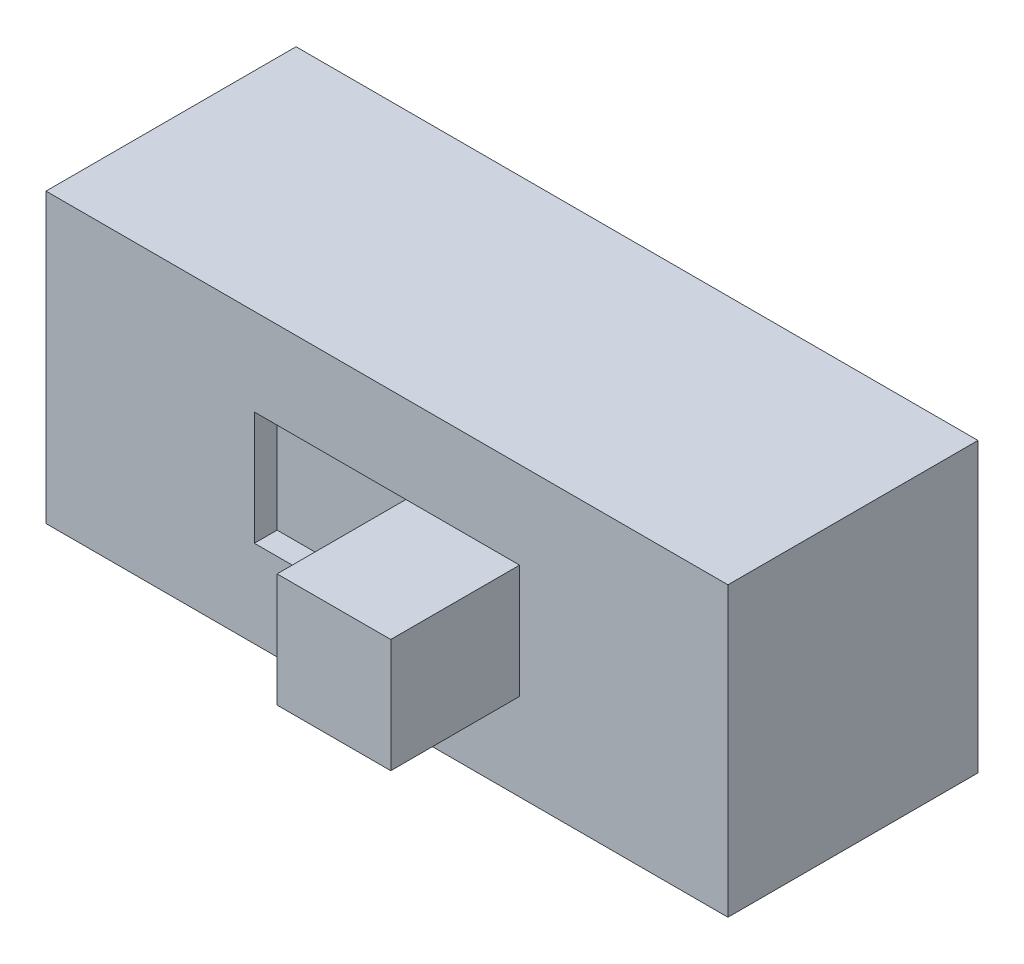
ISO-10303-21;
HEADER;
FILE_DESCRIPTION(('STEP AP214'),'2;1');
FILE_NAME('part.step','',(''),(''),'','','');
FILE_SCHEMA(('AUTOMOTIVE_DESIGN { 1 0 10303 214 1 1 1 1 }'));
ENDSEC;
DATA;
#1=APPLICATION_CONTEXT('core data for automotive mechanical design processes');
#2=APPLICATION_PROTOCOL_DEFINITION('international standard','automotive_design',2000,#1);
#3=PRODUCT_CONTEXT('',#1,'mechanical');
#4=PRODUCT('Part','Part','',(#3));
#5=PRODUCT_RELATED_PRODUCT_CATEGORY('part','',(#4));
#6=PRODUCT_DEFINITION_FORMATION('','',#4);
#7=PRODUCT_DEFINITION_CONTEXT('part definition',#1,'design');
#8=PRODUCT_DEFINITION('design','',#6,#7);
#9=PRODUCT_DEFINITION_SHAPE('','',#8);
#10=(LENGTH_UNIT() NAMED_UNIT(*) SI_UNIT(.MILLI.,.METRE.));
#11=(NAMED_UNIT(*) PLANE_ANGLE_UNIT() SI_UNIT($,.RADIAN.));
#12=(NAMED_UNIT(*) SI_UNIT($,.STERADIAN.) SOLID_ANGLE_UNIT());
#13=UNCERTAINTY_MEASURE_WITH_UNIT(LENGTH_MEASURE(1.E-05),#10,'distance_accuracy_value','');
#14=(GEOMETRIC_REPRESENTATION_CONTEXT(3) GLOBAL_UNCERTAINTY_ASSIGNED_CONTEXT((#13)) GLOBAL_UNIT_ASSIGNED_CONTEXT((#10,
#11,#12)) REPRESENTATION_CONTEXT('',''));
#15=CARTESIAN_POINT('',(0.,0.,0.));
#16=DIRECTION('',(0.,0.,1.));
#17=DIRECTION('',(1.,0.,0.));
#18=AXIS2_PLACEMENT_3D('',#15,#16,#17);
#19=CARTESIAN_POINT('',(1.,0.,5.));
#20=DIRECTION('',(0.,0.,1.));
#21=DIRECTION('',(1.,0.,0.));
#22=AXIS2_PLACEMENT_3D('',#19,#20,#21);
#23=PLANE('',#22);
#24=DIRECTION('',(0.,-1.,0.));
#25=VECTOR('',#24,1.);
#26=CARTESIAN_POINT('',(0.250000000000001,0.75,5.));
#27=LINE('',#26,#25);
#28=CARTESIAN_POINT('',(0.250000000000001,-0.75,5.));
#29=VERTEX_POINT('',#28);
#30=CARTESIAN_POINT('',(0.250000000000001,0.750000000000001,5.));
#31=VERTEX_POINT('',#30);
#32=EDGE_CURVE('E123',#29,#31,#27,.F.);
#33=ORIENTED_EDGE('',*,*,#32,.F.);
#34=DIRECTION('',(1.,0.,0.));
#35=VECTOR('',#34,1.);
#36=CARTESIAN_POINT('',(0.250000000000001,-0.75,5.));
#37=LINE('',#36,#35);
#38=CARTESIAN_POINT('',(1.75,-0.75,5.));
#39=VERTEX_POINT('',#38);
#40=EDGE_CURVE('E141',#39,#29,#37,.F.);
#41=ORIENTED_EDGE('',*,*,#40,.F.);
#42=DIRECTION('',(0.,1.,0.));
#43=VECTOR('',#42,1.);
#44=CARTESIAN_POINT('',(1.75,-0.75,5.));
#45=LINE('',#44,#43);
#46=CARTESIAN_POINT('',(1.75,0.750000000000001,5.));
#47=VERTEX_POINT('',#46);
#48=EDGE_CURVE('E171',#47,#39,#45,.F.);
#49=ORIENTED_EDGE('',*,*,#48,.F.);
#50=DIRECTION('',(-1.,0.,0.));
#51=VECTOR('',#50,1.);
#52=CARTESIAN_POINT('',(1.75,0.750000000000001,5.));
#53=LINE('',#52,#51);
#54=EDGE_CURVE('E176',#31,#47,#53,.F.);
#55=ORIENTED_EDGE('',*,*,#54,.F.);
#56=EDGE_LOOP('',(#33,#41,#49,#55));
#57=FACE_BOUND('',#56,.T.);
#58=ADVANCED_FACE('F16',(#57),#23,.T.);
#59=CARTESIAN_POINT('',(0.250000000000001,0.75,3.));
#60=DIRECTION('',(-1.,0.,0.));
#61=DIRECTION('',(0.,-1.,0.));
#62=AXIS2_PLACEMENT_3D('',#59,#60,#61);
#63=PLANE('',#62);
#64=DIRECTION('',(0.,0.,1.));
#65=VECTOR('',#64,1.);
#66=CARTESIAN_POINT('',(0.250000000000001,0.750000000000001,3.));
#67=LINE('',#66,#65);
#68=CARTESIAN_POINT('',(0.250000000000001,0.75,3.3));
#69=VERTEX_POINT('',#68);
#70=EDGE_CURVE('E178',#69,#31,#67,.T.);
#71=ORIENTED_EDGE('',*,*,#70,.F.);
#72=DIRECTION('',(0.,0.,1.));
#73=VECTOR('',#72,1.);
#74=CARTESIAN_POINT('',(0.250000000000001,0.750000000000001,3.3));
#75=LINE('',#74,#73);
#76=CARTESIAN_POINT('',(0.250000000000001,0.750000000000001,3.));
#77=VERTEX_POINT('',#76);
#78=EDGE_CURVE('E117',#69,#77,#75,.F.);
#79=ORIENTED_EDGE('',*,*,#78,.T.);
#80=DIRECTION('',(0.,1.,0.));
#81=VECTOR('',#80,1.);
#82=CARTESIAN_POINT('',(0.250000000000001,0.,3.));
#83=LINE('',#82,#81);
#84=CARTESIAN_POINT('',(0.250000000000001,-0.75,3.));
#85=VERTEX_POINT('',#84);
#86=EDGE_CURVE('E96',#77,#85,#83,.F.);
#87=ORIENTED_EDGE('',*,*,#86,.T.);
#88=DIRECTION('',(0.,0.,1.));
#89=VECTOR('',#88,1.);
#90=CARTESIAN_POINT('',(0.250000000000001,-0.75,3.));
#91=LINE('',#90,#89);
#92=CARTESIAN_POINT('',(0.250000000000001,-0.75,3.3));
#93=VERTEX_POINT('',#92);
#94=EDGE_CURVE('E19',#85,#93,#91,.T.);
#95=ORIENTED_EDGE('',*,*,#94,.T.);
#96=DIRECTION('',(0.,0.,1.));
#97=VECTOR('',#96,1.);
#98=CARTESIAN_POINT('',(0.250000000000001,-0.75,3.));
#99=LINE('',#98,#97);
#100=EDGE_CURVE('E131',#29,#93,#99,.F.);
#101=ORIENTED_EDGE('',*,*,#100,.F.);
#102=ORIENTED_EDGE('',*,*,#32,.T.);
#103=EDGE_LOOP('',(#71,#79,#87,#95,#101,#102));
#104=FACE_BOUND('',#103,.T.);
#105=ADVANCED_FACE('F130',(#104),#63,.T.);
#106=CARTESIAN_POINT('',(0.,0.,3.));
#107=DIRECTION('',(0.,0.,-1.));
#108=DIRECTION('',(-1.,0.,0.));
#109=AXIS2_PLACEMENT_3D('',#106,#107,#108);
#110=PLANE('',#109);
#111=DIRECTION('',(-1.,0.,0.));
#112=VECTOR('',#111,1.);
#113=CARTESIAN_POINT('',(-1.75,0.750000000000001,3.));
#114=LINE('',#113,#112);
#115=CARTESIAN_POINT('',(-1.75,0.750000000000001,3.));
#116=VERTEX_POINT('',#115);
#117=EDGE_CURVE('E110',#77,#116,#114,.T.);
#118=ORIENTED_EDGE('',*,*,#117,.T.);
#119=DIRECTION('',(0.,1.,0.));
#120=VECTOR('',#119,1.);
#121=CARTESIAN_POINT('',(-1.75,-0.750000000000001,3.));
#122=LINE('',#121,#120);
#123=CARTESIAN_POINT('',(-1.75,-0.750000000000001,3.));
#124=VERTEX_POINT('',#123);
#125=EDGE_CURVE('E102',#116,#124,#122,.F.);
#126=ORIENTED_EDGE('',*,*,#125,.T.);
#127=DIRECTION('',(1.,0.,0.));
#128=VECTOR('',#127,1.);
#129=CARTESIAN_POINT('',(1.75,-0.75,3.));
#130=LINE('',#129,#128);
#131=EDGE_CURVE('E165',#124,#85,#130,.T.);
#132=ORIENTED_EDGE('',*,*,#131,.T.);
#133=ORIENTED_EDGE('',*,*,#86,.F.);
#134=EDGE_LOOP('',(#118,#126,#132,#133));
#135=FACE_BOUND('',#134,.T.);
#136=ADVANCED_FACE('F119',(#135),#110,.F.);
#137=CARTESIAN_POINT('',(-1.75,-0.750000000000001,3.3));
#138=DIRECTION('',(-1.,0.,0.));
#139=DIRECTION('',(0.,0.,1.));
#140=AXIS2_PLACEMENT_3D('',#137,#138,#139);
#141=PLANE('',#140);
#142=DIRECTION('',(0.,0.,1.));
#143=VECTOR('',#142,1.);
#144=CARTESIAN_POINT('',(-1.75,-0.750000000000001,3.3));
#145=LINE('',#144,#143);
#146=CARTESIAN_POINT('',(-1.75,-0.750000000000001,3.3));
#147=VERTEX_POINT('',#146);
#148=EDGE_CURVE('E108',#147,#124,#145,.F.);
#149=ORIENTED_EDGE('',*,*,#148,.T.);
#150=ORIENTED_EDGE('',*,*,#125,.F.);
#151=DIRECTION('',(0.,0.,1.));
#152=VECTOR('',#151,1.);
#153=CARTESIAN_POINT('',(-1.75,0.750000000000001,3.3));
#154=LINE('',#153,#152);
#155=CARTESIAN_POINT('',(-1.75,0.750000000000001,3.3));
#156=VERTEX_POINT('',#155);
#157=EDGE_CURVE('E106',#116,#156,#154,.T.);
#158=ORIENTED_EDGE('',*,*,#157,.T.);
#159=DIRECTION('',(0.,1.,0.));
#160=VECTOR('',#159,1.);
#161=CARTESIAN_POINT('',(-1.75,0.,3.3));
#162=LINE('',#161,#160);
#163=EDGE_CURVE('E163',#147,#156,#162,.T.);
#164=ORIENTED_EDGE('',*,*,#163,.F.);
#165=EDGE_LOOP('',(#149,#150,#158,#164));
#166=FACE_BOUND('',#165,.T.);
#167=ADVANCED_FACE('F104',(#166),#141,.F.);
#168=CARTESIAN_POINT('',(-1.75,0.750000000000001,3.3));
#169=DIRECTION('',(0.,1.,0.));
#170=DIRECTION('',(-1.,0.,0.));
#171=AXIS2_PLACEMENT_3D('',#168,#169,#170);
#172=PLANE('',#171);
#173=DIRECTION('',(1.,0.,0.));
#174=VECTOR('',#173,1.);
#175=CARTESIAN_POINT('',(0.,0.750000000000001,3.3));
#176=LINE('',#175,#174);
#177=EDGE_CURVE('E116',#156,#69,#176,.T.);
#178=ORIENTED_EDGE('',*,*,#177,.F.);
#179=ORIENTED_EDGE('',*,*,#157,.F.);
#180=ORIENTED_EDGE('',*,*,#117,.F.);
#181=ORIENTED_EDGE('',*,*,#78,.F.);
#182=EDGE_LOOP('',(#178,#179,#180,#181));
#183=FACE_BOUND('',#182,.T.);
#184=ADVANCED_FACE('F113',(#183),#172,.F.);
#185=CARTESIAN_POINT('',(1.75,0.750000000000001,3.));
#186=DIRECTION('',(0.,1.,0.));
#187=DIRECTION('',(-1.,0.,0.));
#188=AXIS2_PLACEMENT_3D('',#185,#186,#187);
#189=PLANE('',#188);
#190=ORIENTED_EDGE('',*,*,#54,.T.);
#191=DIRECTION('',(0.,0.,-1.));
#192=VECTOR('',#191,1.);
#193=CARTESIAN_POINT('',(1.75,0.75,3.));
#194=LINE('',#193,#192);
#195=CARTESIAN_POINT('',(1.75,0.75,3.3));
#196=VERTEX_POINT('',#195);
#197=EDGE_CURVE('E173',#196,#47,#194,.F.);
#198=ORIENTED_EDGE('',*,*,#197,.F.);
#199=DIRECTION('',(1.,0.,0.));
#200=VECTOR('',#199,1.);
#201=CARTESIAN_POINT('',(0.,0.75,3.3));
#202=LINE('',#201,#200);
#203=EDGE_CURVE('E160',#69,#196,#202,.T.);
#204=ORIENTED_EDGE('',*,*,#203,.F.);
#205=ORIENTED_EDGE('',*,*,#70,.T.);
#206=EDGE_LOOP('',(#190,#198,#204,#205));
#207=FACE_BOUND('',#206,.T.);
#208=ADVANCED_FACE('F182',(#207),#189,.T.);
#209=CARTESIAN_POINT('',(1.75,-0.75,3.));
#210=DIRECTION('',(1.,0.,0.));
#211=DIRECTION('',(0.,0.,-1.));
#212=AXIS2_PLACEMENT_3D('',#209,#210,#211);
#213=PLANE('',#212);
#214=ORIENTED_EDGE('',*,*,#48,.T.);
#215=DIRECTION('',(0.,0.,1.));
#216=VECTOR('',#215,1.);
#217=CARTESIAN_POINT('',(1.75,-0.75,3.));
#218=LINE('',#217,#216);
#219=CARTESIAN_POINT('',(1.75,-0.75,3.3));
#220=VERTEX_POINT('',#219);
#221=EDGE_CURVE('E169',#220,#39,#218,.T.);
#222=ORIENTED_EDGE('',*,*,#221,.F.);
#223=DIRECTION('',(0.,1.,0.));
#224=VECTOR('',#223,1.);
#225=CARTESIAN_POINT('',(1.75,0.,3.3));
#226=LINE('',#225,#224);
#227=EDGE_CURVE('E149',#196,#220,#226,.F.);
#228=ORIENTED_EDGE('',*,*,#227,.F.);
#229=ORIENTED_EDGE('',*,*,#197,.T.);
#230=EDGE_LOOP('',(#214,#222,#228,#229));
#231=FACE_BOUND('',#230,.T.);
#232=ADVANCED_FACE('F186',(#231),#213,.T.);
#233=CARTESIAN_POINT('',(0.250000000000001,-0.75,3.));
#234=DIRECTION('',(0.,-1.,0.));
#235=DIRECTION('',(1.,0.,0.));
#236=AXIS2_PLACEMENT_3D('',#233,#234,#235);
#237=PLANE('',#236);
#238=ORIENTED_EDGE('',*,*,#40,.T.);
#239=ORIENTED_EDGE('',*,*,#100,.T.);
#240=DIRECTION('',(1.,0.,0.));
#241=VECTOR('',#240,1.);
#242=CARTESIAN_POINT('',(0.,-0.75,3.3));
#243=LINE('',#242,#241);
#244=EDGE_CURVE('E139',#220,#93,#243,.F.);
#245=ORIENTED_EDGE('',*,*,#244,.F.);
#246=ORIENTED_EDGE('',*,*,#221,.T.);
#247=EDGE_LOOP('',(#238,#239,#245,#246));
#248=FACE_BOUND('',#247,.T.);
#249=ADVANCED_FACE('F137',(#248),#237,.T.);
#250=CARTESIAN_POINT('',(1.75,-0.75,3.3));
#251=DIRECTION('',(0.,-1.,0.));
#252=DIRECTION('',(1.,0.,0.));
#253=AXIS2_PLACEMENT_3D('',#250,#251,#252);
#254=PLANE('',#253);
#255=ORIENTED_EDGE('',*,*,#131,.F.);
#256=ORIENTED_EDGE('',*,*,#148,.F.);
#257=DIRECTION('',(1.,0.,0.));
#258=VECTOR('',#257,1.);
#259=CARTESIAN_POINT('',(0.,-0.75,3.3));
#260=LINE('',#259,#258);
#261=EDGE_CURVE('E147',#93,#147,#260,.F.);
#262=ORIENTED_EDGE('',*,*,#261,.F.);
#263=ORIENTED_EDGE('',*,*,#94,.F.);
#264=EDGE_LOOP('',(#255,#256,#262,#263));
#265=FACE_BOUND('',#264,.T.);
#266=ADVANCED_FACE('F152',(#265),#254,.F.);
#267=CARTESIAN_POINT('',(0.,0.,3.3));
#268=DIRECTION('',(0.,0.,1.));
#269=DIRECTION('',(1.,0.,0.));
#270=AXIS2_PLACEMENT_3D('',#267,#268,#269);
#271=PLANE('',#270);
#272=ORIENTED_EDGE('',*,*,#244,.T.);
#273=ORIENTED_EDGE('',*,*,#261,.T.);
#274=ORIENTED_EDGE('',*,*,#163,.T.);
#275=ORIENTED_EDGE('',*,*,#177,.T.);
#276=ORIENTED_EDGE('',*,*,#203,.T.);
#277=ORIENTED_EDGE('',*,*,#227,.T.);
#278=EDGE_LOOP('',(#272,#273,#274,#275,#276,#277));
#279=FACE_BOUND('',#278,.T.);
#280=DIRECTION('',(-1.,0.,0.));
#281=VECTOR('',#280,1.);
#282=CARTESIAN_POINT('',(4.5,1.9,3.3));
#283=LINE('',#282,#281);
#284=CARTESIAN_POINT('',(-4.5,1.9,3.3));
#285=VERTEX_POINT('',#284);
#286=CARTESIAN_POINT('',(4.5,1.9,3.3));
#287=VERTEX_POINT('',#286);
#288=EDGE_CURVE('E155',#285,#287,#283,.F.);
#289=ORIENTED_EDGE('',*,*,#288,.F.);
#290=DIRECTION('',(0.,1.,0.));
#291=VECTOR('',#290,1.);
#292=CARTESIAN_POINT('',(-4.5,1.9,3.3));
#293=LINE('',#292,#291);
#294=CARTESIAN_POINT('',(-4.5,-1.9,3.3));
#295=VERTEX_POINT('',#294);
#296=EDGE_CURVE('E388',#295,#285,#293,.T.);
#297=ORIENTED_EDGE('',*,*,#296,.F.);
#298=DIRECTION('',(1.,0.,0.));
#299=VECTOR('',#298,1.);
#300=CARTESIAN_POINT('',(-4.5,-1.9,3.3));
#301=LINE('',#300,#299);
#302=CARTESIAN_POINT('',(4.5,-1.9,3.3));
#303=VERTEX_POINT('',#302);
#304=EDGE_CURVE('E384',#303,#295,#301,.F.);
#305=ORIENTED_EDGE('',*,*,#304,.F.);
#306=DIRECTION('',(0.,1.,0.));
#307=VECTOR('',#306,1.);
#308=CARTESIAN_POINT('',(4.5,-1.9,3.3));
#309=LINE('',#308,#307);
#310=EDGE_CURVE('E153',#287,#303,#309,.F.);
#311=ORIENTED_EDGE('',*,*,#310,.F.);
#312=EDGE_LOOP('',(#289,#297,#305,#311));
#313=FACE_BOUND('',#312,.T.);
#314=ADVANCED_FACE('F145',(#279,#313),#271,.T.);
#315=CARTESIAN_POINT('',(4.5,-1.9,0.));
#316=DIRECTION('',(1.,0.,0.));
#317=DIRECTION('',(0.,0.,-1.));
#318=AXIS2_PLACEMENT_3D('',#315,#316,#317);
#319=PLANE('',#318);
#320=ORIENTED_EDGE('',*,*,#310,.T.);
#321=DIRECTION('',(0.,0.,1.));
#322=VECTOR('',#321,1.);
#323=CARTESIAN_POINT('',(4.5,-1.9,0.));
#324=LINE('',#323,#322);
#325=CARTESIAN_POINT('',(4.5,-1.9,0.));
#326=VERTEX_POINT('',#325);
#327=EDGE_CURVE('E380',#326,#303,#324,.T.);
#328=ORIENTED_EDGE('',*,*,#327,.F.);
#329=DIRECTION('',(0.,1.,0.));
#330=VECTOR('',#329,1.);
#331=CARTESIAN_POINT('',(4.5,0.,0.));
#332=LINE('',#331,#330);
#333=CARTESIAN_POINT('',(4.5,1.9,0.));
#334=VERTEX_POINT('',#333);
#335=EDGE_CURVE('E390',#326,#334,#332,.T.);
#336=ORIENTED_EDGE('',*,*,#335,.T.);
#337=DIRECTION('',(0.,0.,1.));
#338=VECTOR('',#337,1.);
#339=CARTESIAN_POINT('',(4.5,1.9,0.));
#340=LINE('',#339,#338);
#341=EDGE_CURVE('E381',#287,#334,#340,.F.);
#342=ORIENTED_EDGE('',*,*,#341,.F.);
#343=EDGE_LOOP('',(#320,#328,#336,#342));
#344=FACE_BOUND('',#343,.T.);
#345=ADVANCED_FACE('F211',(#344),#319,.T.);
#346=CARTESIAN_POINT('',(4.5,1.9,0.));
#347=DIRECTION('',(0.,1.,0.));
#348=DIRECTION('',(-1.,0.,0.));
#349=AXIS2_PLACEMENT_3D('',#346,#347,#348);
#350=PLANE('',#349);
#351=ORIENTED_EDGE('',*,*,#288,.T.);
#352=ORIENTED_EDGE('',*,*,#341,.T.);
#353=DIRECTION('',(1.,0.,0.));
#354=VECTOR('',#353,1.);
#355=CARTESIAN_POINT('',(0.,1.9,0.));
#356=LINE('',#355,#354);
#357=CARTESIAN_POINT('',(-4.5,1.9,0.));
#358=VERTEX_POINT('',#357);
#359=EDGE_CURVE('E399',#334,#358,#356,.F.);
#360=ORIENTED_EDGE('',*,*,#359,.T.);
#361=DIRECTION('',(0.,0.,1.));
#362=VECTOR('',#361,1.);
#363=CARTESIAN_POINT('',(-4.5,1.9,0.));
#364=LINE('',#363,#362);
#365=EDGE_CURVE('E386',#285,#358,#364,.F.);
#366=ORIENTED_EDGE('',*,*,#365,.F.);
#367=EDGE_LOOP('',(#351,#352,#360,#366));
#368=FACE_BOUND('',#367,.T.);
#369=ADVANCED_FACE('F207',(#368),#350,.T.);
#370=CARTESIAN_POINT('',(-4.5,1.9,0.));
#371=DIRECTION('',(-1.,0.,0.));
#372=DIRECTION('',(0.,0.,1.));
#373=AXIS2_PLACEMENT_3D('',#370,#371,#372);
#374=PLANE('',#373);
#375=ORIENTED_EDGE('',*,*,#296,.T.);
#376=ORIENTED_EDGE('',*,*,#365,.T.);
#377=DIRECTION('',(0.,1.,0.));
#378=VECTOR('',#377,1.);
#379=CARTESIAN_POINT('',(-4.5,0.,0.));
#380=LINE('',#379,#378);
#381=CARTESIAN_POINT('',(-4.5,-1.9,0.));
#382=VERTEX_POINT('',#381);
#383=EDGE_CURVE('E25',#358,#382,#380,.F.);
#384=ORIENTED_EDGE('',*,*,#383,.T.);
#385=DIRECTION('',(0.,0.,1.));
#386=VECTOR('',#385,1.);
#387=CARTESIAN_POINT('',(-4.5,-1.9,0.));
#388=LINE('',#387,#386);
#389=EDGE_CURVE('E33',#295,#382,#388,.F.);
#390=ORIENTED_EDGE('',*,*,#389,.F.);
#391=EDGE_LOOP('',(#375,#376,#384,#390));
#392=FACE_BOUND('',#391,.T.);
#393=ADVANCED_FACE('F201',(#392),#374,.T.);
#394=CARTESIAN_POINT('',(-4.5,-1.9,0.));
#395=DIRECTION('',(0.,-1.,0.));
#396=DIRECTION('',(1.,0.,0.));
#397=AXIS2_PLACEMENT_3D('',#394,#395,#396);
#398=PLANE('',#397);
#399=ORIENTED_EDGE('',*,*,#304,.T.);
#400=ORIENTED_EDGE('',*,*,#389,.T.);
#401=DIRECTION('',(1.,0.,0.));
#402=VECTOR('',#401,1.);
#403=CARTESIAN_POINT('',(0.,-1.9,0.));
#404=LINE('',#403,#402);
#405=EDGE_CURVE('E10',#382,#326,#404,.T.);
#406=ORIENTED_EDGE('',*,*,#405,.T.);
#407=ORIENTED_EDGE('',*,*,#327,.T.);
#408=EDGE_LOOP('',(#399,#400,#406,#407));
#409=FACE_BOUND('',#408,.T.);
#410=ADVANCED_FACE('F195',(#409),#398,.T.);
#411=CARTESIAN_POINT('',(0.,0.,0.));
#412=DIRECTION('',(0.,0.,1.));
#413=DIRECTION('',(1.,0.,0.));
#414=AXIS2_PLACEMENT_3D('',#411,#412,#413);
#415=PLANE('',#414);
#416=ORIENTED_EDGE('',*,*,#383,.F.);
#417=ORIENTED_EDGE('',*,*,#359,.F.);
#418=ORIENTED_EDGE('',*,*,#335,.F.);
#419=ORIENTED_EDGE('',*,*,#405,.F.);
#420=EDGE_LOOP('',(#416,#417,#418,#419));
#421=FACE_BOUND('',#420,.T.);
#422=ADVANCED_FACE('F193',(#421),#415,.F.);
#423=CLOSED_SHELL('',(#58,#105,#136,#167,#184,#208,#232,#249,#266,#314,#345,#369,#393,#410,#422));
#424=MANIFOLD_SOLID_BREP('B1',#423);
#425=ADVANCED_BREP_SHAPE_REPRESENTATION('',(#18,#424),#14);
#426=SHAPE_DEFINITION_REPRESENTATION(#9,#425);
ENDSEC;
END-ISO-10303-21;
